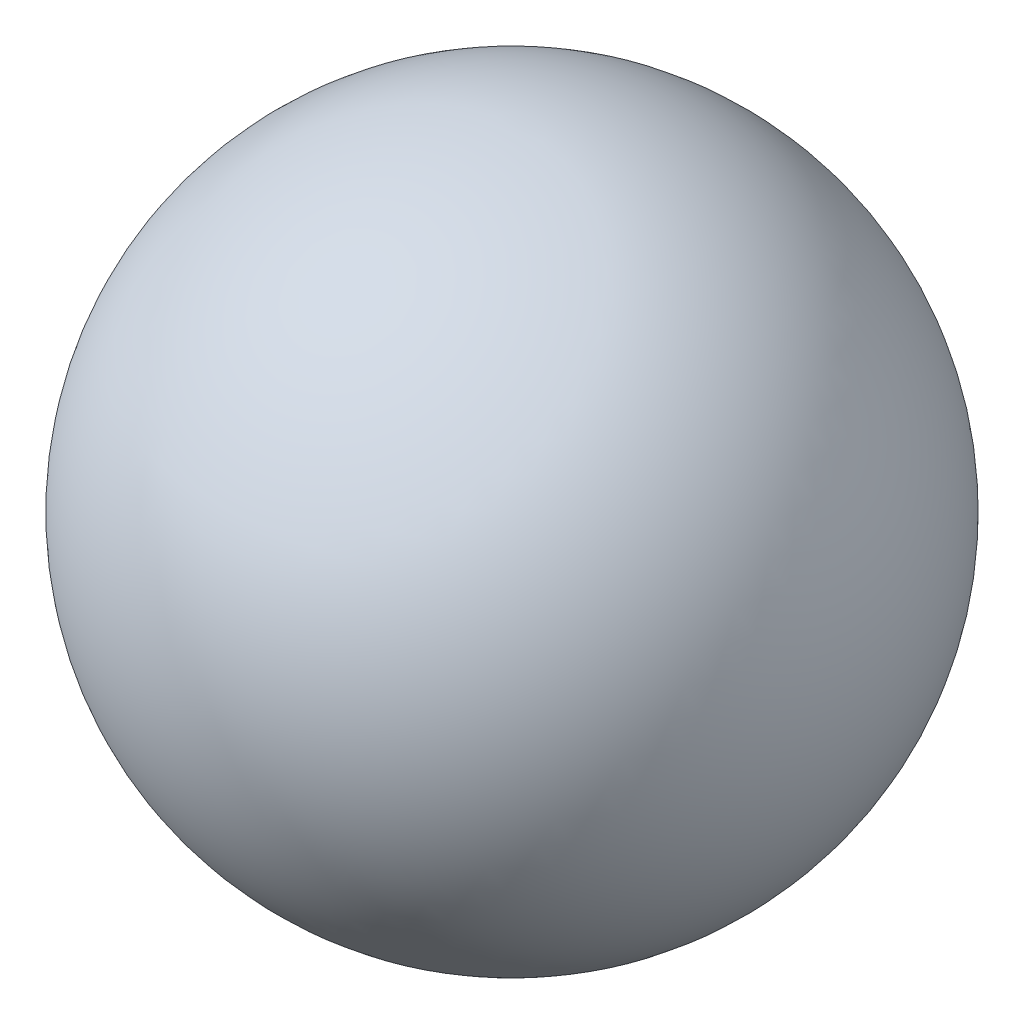
ISO-10303-21;
HEADER;
FILE_DESCRIPTION(('STEP AP214'),'2;1');
FILE_NAME('part.step','',(''),(''),'','','');
FILE_SCHEMA(('AUTOMOTIVE_DESIGN { 1 0 10303 214 1 1 1 1 }'));
ENDSEC;
DATA;
#1=APPLICATION_CONTEXT('core data for automotive mechanical design processes');
#2=APPLICATION_PROTOCOL_DEFINITION('international standard','automotive_design',2000,#1);
#3=PRODUCT_CONTEXT('',#1,'mechanical');
#4=PRODUCT('Part','Part','',(#3));
#5=PRODUCT_RELATED_PRODUCT_CATEGORY('part','',(#4));
#6=PRODUCT_DEFINITION_FORMATION('','',#4);
#7=PRODUCT_DEFINITION_CONTEXT('part definition',#1,'design');
#8=PRODUCT_DEFINITION('design','',#6,#7);
#9=PRODUCT_DEFINITION_SHAPE('','',#8);
#10=(LENGTH_UNIT() NAMED_UNIT(*) SI_UNIT(.MILLI.,.METRE.));
#11=(NAMED_UNIT(*) PLANE_ANGLE_UNIT() SI_UNIT($,.RADIAN.));
#12=(NAMED_UNIT(*) SI_UNIT($,.STERADIAN.) SOLID_ANGLE_UNIT());
#13=UNCERTAINTY_MEASURE_WITH_UNIT(LENGTH_MEASURE(1.E-05),#10,'distance_accuracy_value','');
#14=(GEOMETRIC_REPRESENTATION_CONTEXT(3) GLOBAL_UNCERTAINTY_ASSIGNED_CONTEXT((#13)) GLOBAL_UNIT_ASSIGNED_CONTEXT((#10,
#11,#12)) REPRESENTATION_CONTEXT('',''));
#15=CARTESIAN_POINT('',(0.,0.,0.));
#16=DIRECTION('',(0.,0.,1.));
#17=DIRECTION('',(1.,0.,0.));
#18=AXIS2_PLACEMENT_3D('',#15,#16,#17);
#19=CARTESIAN_POINT('',(-1272.51316831648,956.215571134364,0.));
#20=DIRECTION('',(0.,-1.,0.));
#21=DIRECTION('',(-1.,0.,0.));
#22=AXIS2_PLACEMENT_3D('',#19,#20,#21);
#23=SPHERICAL_SURFACE('',#22,1200.);
#24=CARTESIAN_POINT('',(-1272.51316831648,-243.784428865636,0.));
#25=VERTEX_POINT('',#24);
#26=VERTEX_LOOP('',#25);
#27=FACE_BOUND('',#26,.T.);
#28=ADVANCED_FACE('F39',(#27),#23,.T.);
#29=CLOSED_SHELL('',(#28));
#30=MANIFOLD_SOLID_BREP('B2',#29);
#31=ADVANCED_BREP_SHAPE_REPRESENTATION('',(#18,#30),#14);
#32=SHAPE_DEFINITION_REPRESENTATION(#9,#31);
ENDSEC;
END-ISO-10303-21;
